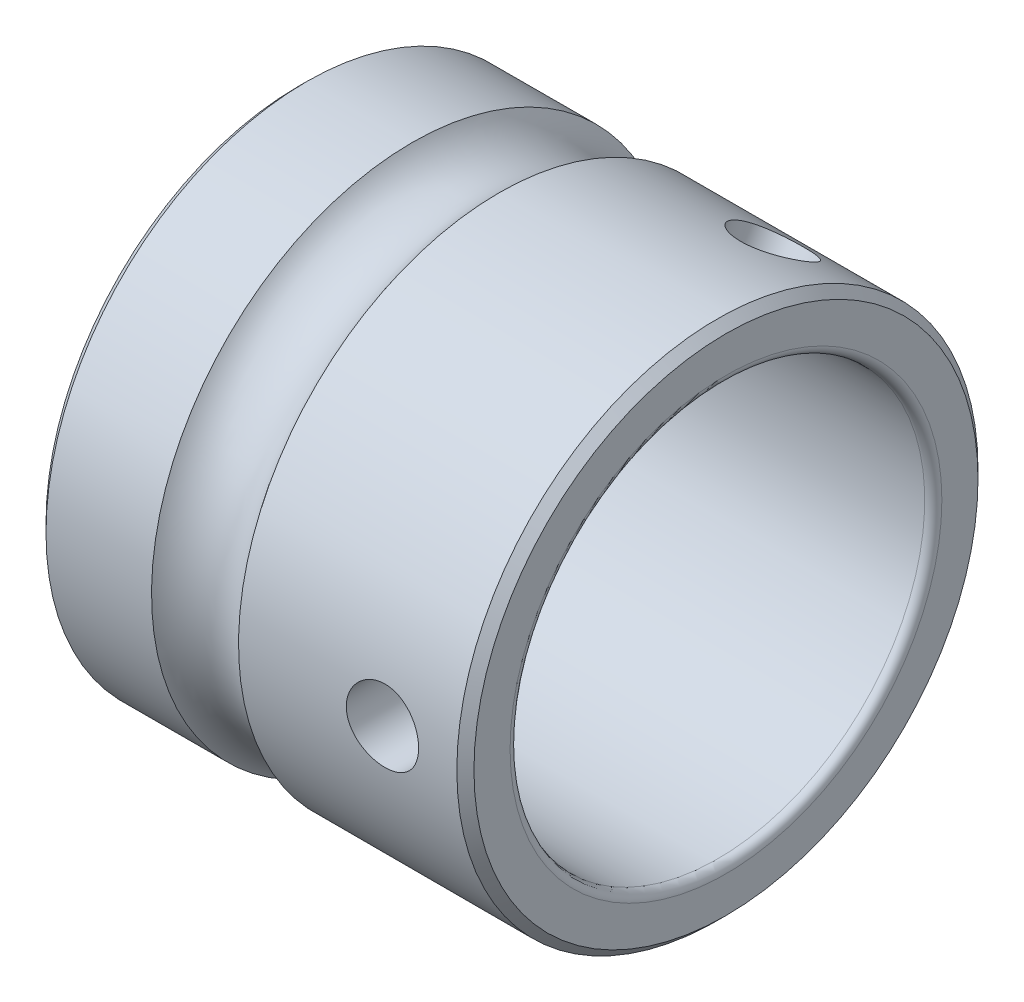
ISO-10303-21;
HEADER;
FILE_DESCRIPTION(('STEP AP214'),'2;1');
FILE_NAME('part.step','',(''),(''),'','','');
FILE_SCHEMA(('AUTOMOTIVE_DESIGN { 1 0 10303 214 1 1 1 1 }'));
ENDSEC;
DATA;
#1=APPLICATION_CONTEXT('core data for automotive mechanical design processes');
#2=APPLICATION_PROTOCOL_DEFINITION('international standard','automotive_design',2000,#1);
#3=PRODUCT_CONTEXT('',#1,'mechanical');
#4=PRODUCT('Part','Part','',(#3));
#5=PRODUCT_RELATED_PRODUCT_CATEGORY('part','',(#4));
#6=PRODUCT_DEFINITION_FORMATION('','',#4);
#7=PRODUCT_DEFINITION_CONTEXT('part definition',#1,'design');
#8=PRODUCT_DEFINITION('design','',#6,#7);
#9=PRODUCT_DEFINITION_SHAPE('','',#8);
#10=(LENGTH_UNIT() NAMED_UNIT(*) SI_UNIT(.MILLI.,.METRE.));
#11=(NAMED_UNIT(*) PLANE_ANGLE_UNIT() SI_UNIT($,.RADIAN.));
#12=(NAMED_UNIT(*) SI_UNIT($,.STERADIAN.) SOLID_ANGLE_UNIT());
#13=UNCERTAINTY_MEASURE_WITH_UNIT(LENGTH_MEASURE(1.E-05),#10,'distance_accuracy_value','');
#14=(GEOMETRIC_REPRESENTATION_CONTEXT(3) GLOBAL_UNCERTAINTY_ASSIGNED_CONTEXT((#13)) GLOBAL_UNIT_ASSIGNED_CONTEXT((#10,
#11,#12)) REPRESENTATION_CONTEXT('',''));
#15=CARTESIAN_POINT('',(0.,0.,0.));
#16=DIRECTION('',(0.,0.,1.));
#17=DIRECTION('',(1.,0.,0.));
#18=AXIS2_PLACEMENT_3D('',#15,#16,#17);
#19=CARTESIAN_POINT('',(-11.6063129103904,0.,0.));
#20=DIRECTION('',(1.,0.,0.));
#21=DIRECTION('',(0.,0.,-1.));
#22=AXIS2_PLACEMENT_3D('',#19,#20,#21);
#23=CYLINDRICAL_SURFACE('',#22,31.42);
#24=CARTESIAN_POINT('',(-5.24462582078074,0.,0.));
#25=DIRECTION('',(1.,0.,0.));
#26=DIRECTION('',(0.,1.,0.));
#27=AXIS2_PLACEMENT_3D('',#24,#25,#26);
#28=CIRCLE('',#27,31.42);
#29=CARTESIAN_POINT('',(-5.24462582078074,31.42,0.));
#30=VERTEX_POINT('',#29);
#31=EDGE_CURVE('E292',#30,#30,#28,.T.);
#32=ORIENTED_EDGE('',*,*,#31,.F.);
#33=EDGE_LOOP('',(#32));
#34=FACE_BOUND('',#33,.T.);
#35=CARTESIAN_POINT('',(-17.968,0.,0.));
#36=DIRECTION('',(1.,0.,0.));
#37=DIRECTION('',(0.,0.,1.));
#38=AXIS2_PLACEMENT_3D('',#35,#36,#37);
#39=CIRCLE('',#38,31.42);
#40=CARTESIAN_POINT('',(-17.968,0.,31.42));
#41=VERTEX_POINT('',#40);
#42=EDGE_CURVE('E132',#41,#41,#39,.F.);
#43=ORIENTED_EDGE('',*,*,#42,.F.);
#44=EDGE_LOOP('',(#43));
#45=FACE_BOUND('',#44,.T.);
#46=ADVANCED_FACE('F14',(#34,#45),#23,.T.);
#47=CARTESIAN_POINT('',(-6.05382410867605E-11,0.,0.));
#48=DIRECTION('',(1.,0.,0.));
#49=DIRECTION('',(0.,1.,0.));
#50=AXIS2_PLACEMENT_3D('',#47,#48,#49);
#51=TOROIDAL_SURFACE('',#50,35.000000000292,6.35000000011462);
#52=ORIENTED_EDGE('',*,*,#31,.T.);
#53=EDGE_LOOP('',(#52));
#54=FACE_BOUND('',#53,.T.);
#55=CARTESIAN_POINT('',(5.24462582069814,0.,0.));
#56=DIRECTION('',(1.,0.,0.));
#57=DIRECTION('',(0.,0.,-1.));
#58=AXIS2_PLACEMENT_3D('',#55,#56,#57);
#59=CIRCLE('',#58,31.4200000000282);
#60=CARTESIAN_POINT('',(5.24462582069814,0.,-31.4200000000282));
#61=VERTEX_POINT('',#60);
#62=EDGE_CURVE('E129',#61,#61,#59,.T.);
#63=ORIENTED_EDGE('',*,*,#62,.F.);
#64=EDGE_LOOP('',(#63));
#65=FACE_BOUND('',#64,.T.);
#66=ADVANCED_FACE('F135',(#54,#65),#51,.F.);
#67=CARTESIAN_POINT('',(31.568,0.,0.));
#68=DIRECTION('',(-1.,0.,0.));
#69=DIRECTION('',(0.,0.,1.));
#70=AXIS2_PLACEMENT_3D('',#67,#68,#69);
#71=CONICAL_SURFACE('',#70,31.42,0.785398163397452);
#72=CARTESIAN_POINT('',(32.6,0.,0.));
#73=DIRECTION('',(-1.,0.,0.));
#74=DIRECTION('',(0.,0.,1.));
#75=AXIS2_PLACEMENT_3D('',#72,#73,#74);
#76=CIRCLE('',#75,30.388);
#77=CARTESIAN_POINT('',(32.6,0.,30.388));
#78=VERTEX_POINT('',#77);
#79=EDGE_CURVE('E17',#78,#78,#76,.F.);
#80=ORIENTED_EDGE('',*,*,#79,.F.);
#81=EDGE_LOOP('',(#80));
#82=FACE_BOUND('',#81,.T.);
#83=CARTESIAN_POINT('',(31.568,0.,0.));
#84=DIRECTION('',(1.,0.,0.));
#85=DIRECTION('',(0.,0.,-1.));
#86=AXIS2_PLACEMENT_3D('',#83,#84,#85);
#87=CIRCLE('',#86,31.4200000000282);
#88=CARTESIAN_POINT('',(31.568,0.,-31.4200000000282));
#89=VERTEX_POINT('',#88);
#90=EDGE_CURVE('E121',#89,#89,#87,.F.);
#91=ORIENTED_EDGE('',*,*,#90,.F.);
#92=EDGE_LOOP('',(#91));
#93=FACE_BOUND('',#92,.T.);
#94=ADVANCED_FACE('F138',(#82,#93),#71,.T.);
#95=CARTESIAN_POINT('',(-17.968,0.,0.));
#96=DIRECTION('',(1.,0.,0.));
#97=DIRECTION('',(0.,0.,-1.));
#98=AXIS2_PLACEMENT_3D('',#95,#96,#97);
#99=CONICAL_SURFACE('',#98,31.42,0.785398163397448);
#100=ORIENTED_EDGE('',*,*,#42,.T.);
#101=EDGE_LOOP('',(#100));
#102=FACE_BOUND('',#101,.T.);
#103=CARTESIAN_POINT('',(-19.,0.,0.));
#104=DIRECTION('',(1.,0.,0.));
#105=DIRECTION('',(0.,0.,-1.));
#106=AXIS2_PLACEMENT_3D('',#103,#104,#105);
#107=CIRCLE('',#106,30.388);
#108=CARTESIAN_POINT('',(-19.,0.,-30.388));
#109=VERTEX_POINT('',#108);
#110=EDGE_CURVE('E166',#109,#109,#107,.F.);
#111=ORIENTED_EDGE('',*,*,#110,.F.);
#112=EDGE_LOOP('',(#111));
#113=FACE_BOUND('',#112,.T.);
#114=ADVANCED_FACE('F142',(#102,#113),#99,.T.);
#115=CARTESIAN_POINT('',(18.4063129103491,0.,0.));
#116=DIRECTION('',(1.,0.,0.));
#117=DIRECTION('',(0.,0.,-1.));
#118=AXIS2_PLACEMENT_3D('',#115,#116,#117);
#119=CYLINDRICAL_SURFACE('',#118,31.4200000000282);
#120=ORIENTED_EDGE('',*,*,#62,.T.);
#121=EDGE_LOOP('',(#120));
#122=FACE_BOUND('',#121,.T.);
#123=ORIENTED_EDGE('',*,*,#90,.T.);
#124=EDGE_LOOP('',(#123));
#125=FACE_BOUND('',#124,.T.);
#126=CARTESIAN_POINT('',(22.6,-4.36,31.1160215966272));
#127=CARTESIAN_POINT('',(22.4781439605067,-4.36000028885953,31.1160213328249));
#128=CARTESIAN_POINT('',(22.3563042300934,-4.35488624588262,31.1167396799184));
#129=CARTESIAN_POINT('',(22.1134877119475,-4.33448635530474,31.1195873630422));
#130=CARTESIAN_POINT('',(21.9925111480875,-4.31919795932851,31.1217170525716));
#131=CARTESIAN_POINT('',(21.6320016343975,-4.25815460713502,31.1301520130564));
#132=CARTESIAN_POINT('',(21.3948999541513,-4.19722149668396,31.1385031683592));
#133=CARTESIAN_POINT('',(20.9346832104327,-4.03679982265179,31.1597030101897));
#134=CARTESIAN_POINT('',(20.7115580517538,-3.93733946911539,31.1725484053241));
#135=CARTESIAN_POINT('',(20.2851703980544,-3.70274615153512,31.2012817781311));
#136=CARTESIAN_POINT('',(20.0819039706414,-3.56762026961565,31.2171691515847));
#137=CARTESIAN_POINT('',(19.6996286362064,-3.2645546009021,31.2503182844977));
#138=CARTESIAN_POINT('',(19.5207739762105,-3.09642117878363,31.2675877796414));
#139=CARTESIAN_POINT('',(19.1936798081257,-2.73248011410228,31.3014901238441));
#140=CARTESIAN_POINT('',(19.0454486124054,-2.53666498190386,31.3181227990503));
#141=CARTESIAN_POINT('',(18.783239731258,-2.12189336613058,31.3489613417113));
#142=CARTESIAN_POINT('',(18.6694200820525,-1.90283617499985,31.3631558870098));
#143=CARTESIAN_POINT('',(18.480360958041,-1.44863736985925,31.3874076608577));
#144=CARTESIAN_POINT('',(18.4050784387897,-1.2135140354252,31.397469502978));
#145=CARTESIAN_POINT('',(18.3135768331526,-0.81426620218851,31.4098549226556));
#146=CARTESIAN_POINT('',(18.2860251653387,-0.652693099828707,31.4136410400557));
#147=CARTESIAN_POINT('',(18.2492333103389,-0.327436645000443,31.4187148420164));
#148=CARTESIAN_POINT('',(18.2399929388226,-0.16375331379127,31.4200025517273));
#149=CARTESIAN_POINT('',(18.2400105057765,0.243635815555746,31.4199962035536));
#150=CARTESIAN_POINT('',(18.2604912663354,0.487426545597846,31.4171362651991));
#151=CARTESIAN_POINT('',(18.3418636910551,0.968217614006117,31.4060019915982));
#152=CARTESIAN_POINT('',(18.4027983190611,1.20521045324248,31.3977219000338));
#153=CARTESIAN_POINT('',(18.5632348628189,1.66536274744144,31.3766790092347));
#154=CARTESIAN_POINT('',(18.6627082821704,1.88853228255821,31.3639195228124));
#155=CARTESIAN_POINT('',(18.8973330209615,2.31496996046621,31.3353322181702));
#156=CARTESIAN_POINT('',(19.0324783903694,2.51824141448552,31.3195049117752));
#157=CARTESIAN_POINT('',(19.3355821870425,2.90052281918931,31.2864260870907));
#158=CARTESIAN_POINT('',(19.5037331360614,3.07937944758468,31.269166573188));
#159=CARTESIAN_POINT('',(19.8676613593569,3.40643259659328,31.2352320096018));
#160=CARTESIAN_POINT('',(20.0634402115443,3.55462736482445,31.2185569933685));
#161=CARTESIAN_POINT('',(20.4780803916985,3.8167341588132,31.1876015981238));
#162=CARTESIAN_POINT('',(20.6970348931987,3.93050011198795,31.1733315329895));
#163=CARTESIAN_POINT('',(21.151173674659,4.1195864835792,31.1489093275967));
#164=CARTESIAN_POINT('',(21.3863571707184,4.194908757447,31.1387569886045));
#165=CARTESIAN_POINT('',(21.8646761230343,4.30449894420552,31.1237973152869));
#166=CARTESIAN_POINT('',(22.1077507675658,4.33902756533294,31.1189560527665));
#167=CARTESIAN_POINT('',(22.5962895619403,4.36685688174697,31.1150633911675));
#168=CARTESIAN_POINT('',(22.8417535971883,4.36015954459612,31.1160117157733));
#169=CARTESIAN_POINT('',(23.3262697550033,4.30594301869854,31.1235598341446));
#170=CARTESIAN_POINT('',(23.5653549471946,4.25871287117661,31.1301196113345));
#171=CARTESIAN_POINT('',(24.0321812580593,4.12521342525057,31.1480899000041));
#172=CARTESIAN_POINT('',(24.2599220048494,4.0389428479925,31.1595005703845));
#173=CARTESIAN_POINT('',(24.6984594756343,3.82953664979193,31.1859293365885));
#174=CARTESIAN_POINT('',(24.9091955893904,3.70627596350621,31.2009596359492));
#175=CARTESIAN_POINT('',(25.3071661824918,3.42636131715183,31.2329340878944));
#176=CARTESIAN_POINT('',(25.4944012107407,3.26970813724617,31.2498781957614));
#177=CARTESIAN_POINT('',(25.7543209987039,3.01246785366675,31.2753732662712));
#178=CARTESIAN_POINT('',(25.8378107787805,2.92254008572263,31.2839247271346));
#179=CARTESIAN_POINT('',(25.9969218599237,2.73596880189606,31.3007928737723));
#180=CARTESIAN_POINT('',(26.0725460192785,2.6393277469981,31.3091096440247));
#181=CARTESIAN_POINT('',(26.2154514865844,2.43991347389765,31.3252811380016));
#182=CARTESIAN_POINT('',(26.2827258155648,2.33713523094913,31.3331354723685));
#183=CARTESIAN_POINT('',(26.4083629050489,2.12627039525691,31.3481504926417));
#184=CARTESIAN_POINT('',(26.4667290053922,2.01818581213278,31.3553114381407));
#185=CARTESIAN_POINT('',(26.5742437785161,1.79724939849194,31.3687513622715));
#186=CARTESIAN_POINT('',(26.6233769476182,1.68438993255117,31.3750288530715));
#187=CARTESIAN_POINT('',(26.7119260615412,1.45491651189205,31.3865067803008));
#188=CARTESIAN_POINT('',(26.7513457283886,1.33830401468894,31.3917076291561));
#189=CARTESIAN_POINT('',(26.8201384739176,1.10232137409462,31.4008790974697));
#190=CARTESIAN_POINT('',(26.8495283925863,0.982956215866032,31.4048517779616));
#191=CARTESIAN_POINT('',(26.8981201363818,0.742182802466858,31.4114637410577));
#192=CARTESIAN_POINT('',(26.9173268939031,0.620775565868482,31.4141036691745));
#193=CARTESIAN_POINT('',(26.9409070378546,0.4160179001002,31.4173549268338));
#194=CARTESIAN_POINT('',(26.9480642480532,0.332983528542977,31.4183456017258));
#195=CARTESIAN_POINT('',(26.9576109495109,0.166635680973159,31.4196682167637));
#196=CARTESIAN_POINT('',(26.9600004352284,0.0833222046362633,31.420000156144));
#197=CARTESIAN_POINT('',(26.959999363981,-0.121762525423821,31.4199997718891));
#198=CARTESIAN_POINT('',(26.954894978765,-0.243543690397607,31.419290343672));
#199=CARTESIAN_POINT('',(26.9345096773243,-0.486282816040932,31.4164713950618));
#200=CARTESIAN_POINT('',(26.9192239433273,-0.60724035958924,31.4143612118387));
#201=CARTESIAN_POINT('',(26.8785536482422,-0.847620637553832,31.4087951840496));
#202=CARTESIAN_POINT('',(26.8531525741228,-0.96704053108043,31.4053371393313));
#203=CARTESIAN_POINT('',(26.7924304527545,-1.20333439937484,31.3971713509501));
#204=CARTESIAN_POINT('',(26.7571056519217,-1.32020739273484,31.3924631344552));
#205=CARTESIAN_POINT('',(26.6768616932676,-1.55036429097719,31.3819378442981));
#206=CARTESIAN_POINT('',(26.6319568913194,-1.66365327806917,31.3761224311854));
#207=CARTESIAN_POINT('',(26.5328304688494,-1.8860737972753,31.363538372017));
#208=CARTESIAN_POINT('',(26.4786054101329,-1.99520377693784,31.3567693743555));
#209=CARTESIAN_POINT('',(26.3612868919929,-2.20841913925438,31.3424742765105));
#210=CARTESIAN_POINT('',(26.2982006767746,-2.31250855013999,31.3349487961843));
#211=CARTESIAN_POINT('',(26.1635471313451,-2.5150600690941,31.3193422080005));
#212=CARTESIAN_POINT('',(26.0919766647469,-2.61352007606912,31.3112608951337));
#213=CARTESIAN_POINT('',(25.9404448248629,-2.80463616564106,31.2947227107593));
#214=CARTESIAN_POINT('',(25.8604383166102,-2.89725630289333,31.2862639749068));
#215=CARTESIAN_POINT('',(25.6928986901886,-3.0754741347036,31.2692481014114));
#216=CARTESIAN_POINT('',(25.60536277492,-3.16106919623936,31.2606909282316));
#217=CARTESIAN_POINT('',(25.4234009934648,-3.32460061746563,31.2437224126652));
#218=CARTESIAN_POINT('',(25.3289754155396,-3.40253729726069,31.2353110641955));
#219=CARTESIAN_POINT('',(25.1338499828762,-3.5502368848724,31.2188683890865));
#220=CARTESIAN_POINT('',(25.0331479061599,-3.61999687254772,31.2108371988197));
#221=CARTESIAN_POINT('',(24.8257387964435,-3.75110718196944,31.1953517981783));
#222=CARTESIAN_POINT('',(24.7190071306648,-3.81241886734283,31.1879003023347));
#223=CARTESIAN_POINT('',(24.5007001414539,-3.92582081920585,31.1738287192687));
#224=CARTESIAN_POINT('',(24.3891248156751,-3.97791108122807,31.1672086324491));
#225=CARTESIAN_POINT('',(24.1620325363125,-4.07243949636983,31.154998128714));
#226=CARTESIAN_POINT('',(24.0465196858897,-4.1148873639944,31.1494066765611));
#227=CARTESIAN_POINT('',(23.8123091842008,-4.18987205683866,31.1394091010117));
#228=CARTESIAN_POINT('',(23.6936122404762,-4.22241106439077,31.1350027166402));
#229=CARTESIAN_POINT('',(23.4142506582936,-4.28641366526171,31.1262661278478));
#230=CARTESIAN_POINT('',(23.2526612804907,-4.31397980234257,31.1224407952078));
#231=CARTESIAN_POINT('',(22.9273714486608,-4.35077269554986,31.1173187178144));
#232=CARTESIAN_POINT('',(22.7636710131036,-4.35999961201814,31.1160219509534));
#233=CARTESIAN_POINT('',(22.6,-4.36,31.1160215966272));
#234=B_SPLINE_CURVE_WITH_KNOTS('',3,(#126,#127,#128,#129,#130,#131,#132,#133,#134,#135,#136,
#137,#138,#139,#140,#141,#142,#143,#144,#145,#146,#147,#148,#149,#150,#151,#152,#153,#154,#155,
#156,#157,#158,#159,#160,#161,#162,#163,#164,#165,#166,#167,#168,#169,#170,#171,#172,#173,#174,
#175,#176,#177,#178,#179,#180,#181,#182,#183,#184,#185,#186,#187,#188,#189,#190,#191,#192,#193,
#194,#195,#196,#197,#198,#199,#200,#201,#202,#203,#204,#205,#206,#207,#208,#209,#210,#211,#212,
#213,#214,#215,#216,#217,#218,#219,#220,#221,#222,#223,#224,#225,#226,#227,#228,#229,#230,#231,
#232,#233),.UNSPECIFIED.,.T.,.F.,(4,2,2,2,2,2,2,2,2,2,2,2,2,2,2,2,2,2,2,2,2,2,2,2,2,2,2,2,2,2,2,
2,2,2,2,2,2,2,2,2,2,2,2,2,2,2,2,2,2,2,2,2,2,4),(0.,0.365416070032876,0.730923700476167,
1.46197181264685,2.19248565258952,2.92285454296918,3.65764350377461,4.39263165285107,
5.13094570509602,5.86843328049128,6.3592953848962,6.85015254801897,7.5804607322627,
8.31154578042212,9.04209127733523,9.772514997192,10.5073331713012,11.2421933300358,
11.9801289569181,12.7180289645996,13.4511871673455,14.1843103794328,14.9122486908975,
15.6402108492866,16.3706625569622,17.1010972006552,17.4697595206913,17.8382874009815,
18.2071212597879,18.5758164952974,18.9451254069291,19.3142925856884,19.6828368461029,
20.0512024321131,20.3011164250166,20.5510307084039,20.9162418117053,21.2816258542864,
21.6476088382615,22.013730439695,22.3793072047886,22.7450191198529,23.1104337783204,
23.4759839439503,23.8436000008736,24.2113532182401,24.5790910577365,24.9469598298293,
25.316458770758,25.685957890693,26.0550830806624,26.4241269154158,26.9149400220156,
27.4057488373628),.UNSPECIFIED.);
#235=CARTESIAN_POINT('',(22.6,-4.36,31.1160215966272));
#236=VERTEX_POINT('',#235);
#237=EDGE_CURVE('E80',#236,#236,#234,.T.);
#238=ORIENTED_EDGE('',*,*,#237,.T.);
#239=EDGE_LOOP('',(#238));
#240=FACE_BOUND('',#239,.T.);
#241=CARTESIAN_POINT('',(22.6,29.1272651673844,-11.7821400378135));
#242=CARTESIAN_POINT('',(22.4781439605067,29.1272650833547,-11.7821396557527));
#243=CARTESIAN_POINT('',(22.3563042300934,29.1253301686979,-11.7869277204334));
#244=CARTESIAN_POINT('',(22.1134877119475,29.1175963893361,-11.8060183854702));
#245=CARTESIAN_POINT('',(21.9925111480875,29.1117965565826,-11.8203233695335));
#246=CARTESIAN_POINT('',(21.6320016343975,29.0885797705456,-11.8774059435075));
#247=CARTESIAN_POINT('',(21.3948999541513,29.0653455279633,-11.9343511427412));
#248=CARTESIAN_POINT('',(20.9346832104326,29.0034942925286,-12.0838803086859));
#249=CARTESIAN_POINT('',(20.7115580517538,28.9648885542684,-12.176438199085));
#250=CARTESIAN_POINT('',(20.2851703980544,28.8724757262656,-12.3939686580711));
#251=CARTESIAN_POINT('',(20.0819039706414,28.818671654316,-12.5189347912489));
#252=CARTESIAN_POINT('',(19.6996286362064,28.6958468111753,-12.7979719258263));
#253=CARTESIAN_POINT('',(19.5207739762105,28.6267359216212,-12.952214488178));
#254=CARTESIAN_POINT('',(19.1936798081257,28.4741256806078,-13.2843478677737));
#255=CARTESIAN_POINT('',(19.0454486124054,28.3906224337701,-13.4622450843061));
#256=CARTESIAN_POINT('',(18.783239731258,28.2099435872436,-13.836867111665));
#257=CARTESIAN_POINT('',(18.6694200820525,28.1127078285018,-14.033673476715));
#258=CARTESIAN_POINT('',(18.480360958041,27.9066110781706,-14.4391470672593));
#259=CARTESIAN_POINT('',(18.4050784387897,27.7977632218387,-14.6478007689618));
#260=CARTESIAN_POINT('',(18.3135768331526,27.6088653932977,-14.9997522447895));
#261=CARTESIAN_POINT('',(18.2860251653387,27.531357715968,-15.1415717147014));
#262=CARTESIAN_POINT('',(18.2492333103389,27.3731235299456,-15.4257889683079));
#263=CARTESIAN_POINT('',(18.2399929388226,27.2923970536634,-15.5681867461666));
#264=CARTESIAN_POINT('',(18.2400105057765,27.0886969913101,-15.9209929073198));
#265=CARTESIAN_POINT('',(18.2604912663354,26.9643248470208,-16.1306919035662));
#266=CARTESIAN_POINT('',(18.3418636910551,26.7142867490256,-16.54150204592));
#267=CARTESIAN_POINT('',(18.4027983190611,26.588619559767,-16.7426038194315));
#268=CARTESIAN_POINT('',(18.5632348628189,26.3403197346665,-17.1305859504179));
#269=CARTESIAN_POINT('',(18.6627082821704,26.2176849277272,-17.3174766939687));
#270=CARTESIAN_POINT('',(18.8973330209615,25.9797087567272,-17.6724889038467));
#271=CARTESIAN_POINT('',(19.0324783903694,25.864366180306,-17.8406134936941));
#272=CARTESIAN_POINT('',(19.3355821870425,25.64457837545,-18.1551394892198));
#273=CARTESIAN_POINT('',(19.5037331360613,25.5402028837557,-18.3014041160941));
#274=CARTESIAN_POINT('',(19.8676613593569,25.3472881151193,-18.5676731697301));
#275=CARTESIAN_POINT('',(20.0634402115443,25.2587497433372,-18.6876760956096));
#276=CARTESIAN_POINT('',(20.4780803916985,25.1008881876768,-18.899189540086));
#277=CARTESIAN_POINT('',(20.6970348931987,25.0316469721694,-18.9905787130539));
#278=CARTESIAN_POINT('',(21.151173674659,24.9159535360871,-19.1421212116649));
#279=CARTESIAN_POINT('',(21.3863571707184,24.8695002156782,-19.2022760448092));
#280=CARTESIAN_POINT('',(21.8646761230343,24.8017496651736,-19.2897040938887));
#281=CARTESIAN_POINT('',(22.1077507675658,24.7802926982808,-19.3171861256826));
#282=CARTESIAN_POINT('',(22.5962895619403,24.7630068962407,-19.3393406898676));
#283=CARTESIAN_POINT('',(22.8417535971883,24.7671768380158,-19.3340147880601));
#284=CARTESIAN_POINT('',(23.3262697550033,24.8008219632249,-19.2908359585135));
#285=CARTESIAN_POINT('',(23.5653549471946,24.8301179706755,-19.25321333953));
#286=CARTESIAN_POINT('',(24.0321812580593,24.9124304201397,-19.1465845723017));
#287=CARTESIAN_POINT('',(24.2599220048494,24.9654476391924,-19.0775773959873));
#288=CARTESIAN_POINT('',(24.6984594756343,25.0930387212161,-18.9094406917377));
#289=CARTESIAN_POINT('',(24.9091955893904,25.1676856854318,-18.8102089558067));
#290=CARTESIAN_POINT('',(25.3071661824918,25.3353336962655,-18.583782987145));
#291=CARTESIAN_POINT('',(25.4944012107407,25.4283343140757,-18.4565894076966));
#292=CARTESIAN_POINT('',(25.7543209987039,25.5790338345982,-18.246560322495));
#293=CARTESIAN_POINT('',(25.8378107787805,25.6314035009174,-18.1729563213815));
#294=CARTESIAN_POINT('',(25.9969218599237,25.7392973863337,-18.0198149232899));
#295=CARTESIAN_POINT('',(26.0725460192785,25.7948204480986,-17.9402796998259));
#296=CARTESIAN_POINT('',(26.2154514865844,25.90853250925,-17.7756676204321));
#297=CARTESIAN_POINT('',(26.2827258155648,25.9667236838159,-17.6905862182659));
#298=CARTESIAN_POINT('',(26.4083629050489,26.0851594906569,-17.5154794239281));
#299=CARTESIAN_POINT('',(26.4667290053922,26.1454033429362,-17.4254559019347));
#300=CARTESIAN_POINT('',(26.5742437785161,26.2675108654788,-17.2408393171661));
#301=CARTESIAN_POINT('',(26.6233769476182,26.329377064954,-17.1462388980038));
#302=CARTESIAN_POINT('',(26.7119260615412,26.454053951847,-16.9532480498344));
#303=CARTESIAN_POINT('',(26.7513457283886,26.5168642676784,-16.8548590892854));
#304=CARTESIAN_POINT('',(26.8201384739176,26.6427983125252,-16.6550778618354));
#305=CARTESIAN_POINT('',(26.8495283925863,26.7059213338666,-16.5536909427286));
#306=CARTESIAN_POINT('',(26.8981201363818,26.8320341685763,-16.3484810317171));
#307=CARTESIAN_POINT('',(26.9173268939031,26.8950240316888,-16.2446592446781));
#308=CARTESIAN_POINT('',(26.9409070378546,27.0002185363001,-16.0689595333328));
#309=CARTESIAN_POINT('',(26.9480642480532,27.0425936717021,-15.9975449956229));
#310=CARTESIAN_POINT('',(26.9576109495109,27.1269130137093,-15.8541448412815));
#311=CARTESIAN_POINT('',(26.9600004352284,27.1688572198135,-15.7821592239863));
#312=CARTESIAN_POINT('',(26.959999363981,27.2713992520691,-15.6045504456986));
#313=CARTESIAN_POINT('',(26.954894978765,27.3316754516979,-15.4987301490203));
#314=CARTESIAN_POINT('',(26.9345096773243,27.4506037334111,-15.2871024254156));
#315=CARTESIAN_POINT('',(26.9192239433273,27.5092550329075,-15.1812950283119));
#316=CARTESIAN_POINT('',(26.8785536482422,27.6246248504262,-14.9703365871313));
#317=CARTESIAN_POINT('',(26.8531525741228,27.681340042616,-14.8651869032608));
#318=CARTESIAN_POINT('',(26.7924304527545,27.7924151965832,-14.6564675163688));
#319=CARTESIAN_POINT('',(26.7571056519217,27.846774258172,-14.5528984268552));
#320=CARTESIAN_POINT('',(26.6768616932676,27.9527375386349,-14.3483140610426));
#321=CARTESIAN_POINT('',(26.6319568913193,28.0043457366919,-14.2472952136956));
#322=CARTESIAN_POINT('',(26.5328304688494,28.1046578813724,-14.0483813641559));
#323=CARTESIAN_POINT('',(26.4786054101329,28.1533607472706,-13.9504875306229));
#324=CARTESIAN_POINT('',(26.3612868919929,28.2475885105456,-13.7586900614572));
#325=CARTESIAN_POINT('',(26.2982006767746,28.2931159588502,-13.6647832472023));
#326=CARTESIAN_POINT('',(26.1635471313451,28.3808760164937,-13.4815651921209));
#327=CARTESIAN_POINT('',(26.0919766647469,28.4231073977426,-13.3922556683904));
#328=CARTESIAN_POINT('',(25.9404448248629,28.5043429547279,-13.2184751875619));
#329=CARTESIAN_POINT('',(25.8604383166102,28.5433275432218,-13.1340344278732));
#330=CARTESIAN_POINT('',(25.6928986901886,28.6177002804124,-12.9711853213705));
#331=CARTESIAN_POINT('',(25.60536277492,28.653087081822,-12.8927792370521));
#332=CARTESIAN_POINT('',(25.4234009934648,28.7201576268901,-12.74267261417));
#333=CARTESIAN_POINT('',(25.3289754155396,28.7518415253328,-12.670971795346));
#334=CARTESIAN_POINT('',(25.1338499828762,28.811451544788,-12.5348388627912));
#335=CARTESIAN_POINT('',(25.0331479061599,28.8393763238321,-12.4704093461634));
#336=CARTESIAN_POINT('',(24.8257387964435,28.8915207281997,-12.3491217871854));
#337=CARTESIAN_POINT('',(24.7190071306648,28.9157233861896,-12.2922985621814));
#338=CARTESIAN_POINT('',(24.5007001414539,28.9602380137145,-12.1870537994963));
#339=CARTESIAN_POINT('',(24.3891248156751,28.9805499813646,-12.1386322658855));
#340=CARTESIAN_POINT('',(24.1620325363125,29.0172395825079,-12.0506630051257));
#341=CARTESIAN_POINT('',(24.0465196858897,29.0336211767117,-12.0111063473499));
#342=CARTESIAN_POINT('',(23.8123091842008,29.0624553687318,-11.941168910677));
#343=CARTESIAN_POINT('',(23.6936122404762,29.0749088317033,-11.9107861113372));
#344=CARTESIAN_POINT('',(23.4142506582936,29.0993440243021,-11.8509899386785));
#345=CARTESIAN_POINT('',(23.2526612804907,29.1098142575984,-11.8252042973623));
#346=CARTESIAN_POINT('',(22.9273714486608,29.1237748550592,-11.7907796784694));
#347=CARTESIAN_POINT('',(22.7636710131036,29.1272652802489,-11.7821405509787));
#348=CARTESIAN_POINT('',(22.6,29.1272651673844,-11.7821400378135));
#349=B_SPLINE_CURVE_WITH_KNOTS('',3,(#241,#242,#243,#244,#245,#246,#247,#248,#249,#250,#251,
#252,#253,#254,#255,#256,#257,#258,#259,#260,#261,#262,#263,#264,#265,#266,#267,#268,#269,#270,
#271,#272,#273,#274,#275,#276,#277,#278,#279,#280,#281,#282,#283,#284,#285,#286,#287,#288,#289,
#290,#291,#292,#293,#294,#295,#296,#297,#298,#299,#300,#301,#302,#303,#304,#305,#306,#307,#308,
#309,#310,#311,#312,#313,#314,#315,#316,#317,#318,#319,#320,#321,#322,#323,#324,#325,#326,#327,
#328,#329,#330,#331,#332,#333,#334,#335,#336,#337,#338,#339,#340,#341,#342,#343,#344,#345,#346,
#347,#348),.UNSPECIFIED.,.T.,.F.,(4,2,2,2,2,2,2,2,2,2,2,2,2,2,2,2,2,2,2,2,2,2,2,2,2,2,2,2,2,2,2,
2,2,2,2,2,2,2,2,2,2,2,2,2,2,2,2,2,2,2,2,2,2,4),(0.,0.365416070032876,0.730923700476166,
1.46197181264685,2.19248565258952,2.92285454296919,3.65764350377461,4.39263165285108,
5.13094570509603,5.86843328049128,6.3592953848962,6.85015254801897,7.58046073226269,
8.31154578042212,9.04209127733523,9.772514997192,10.5073331713012,11.2421933300357,
11.9801289569181,12.7180289645996,13.4511871673455,14.1843103794328,14.9122486908975,
15.6402108492866,16.3706625569622,17.1010972006552,17.4697595206913,17.8382874009815,
18.2071212597878,18.5758164952974,18.9451254069291,19.3142925856884,19.6828368461029,
20.0512024321131,20.3011164250166,20.5510307084039,20.9162418117053,21.2816258542864,
21.6476088382615,22.013730439695,22.3793072047886,22.7450191198528,23.1104337783204,
23.4759839439503,23.8436000008736,24.2113532182401,24.5790910577365,24.9469598298293,
25.316458770758,25.685957890693,26.0550830806624,26.4241269154158,26.9149400220156,
27.4057488373628),.UNSPECIFIED.);
#350=CARTESIAN_POINT('',(22.6,29.1272651673844,-11.7821400378135));
#351=VERTEX_POINT('',#350);
#352=EDGE_CURVE('E64',#351,#351,#349,.T.);
#353=ORIENTED_EDGE('',*,*,#352,.T.);
#354=EDGE_LOOP('',(#353));
#355=FACE_BOUND('',#354,.T.);
#356=ADVANCED_FACE('F145',(#122,#125,#240,#355),#119,.T.);
#357=CARTESIAN_POINT('',(32.6,0.,28.21));
#358=DIRECTION('',(1.,0.,0.));
#359=DIRECTION('',(0.,0.,-1.));
#360=AXIS2_PLACEMENT_3D('',#357,#358,#359);
#361=PLANE('',#360);
#362=ORIENTED_EDGE('',*,*,#79,.T.);
#363=EDGE_LOOP('',(#362));
#364=FACE_BOUND('',#363,.T.);
#365=CARTESIAN_POINT('',(32.6,0.,0.));
#366=DIRECTION('',(1.,0.,0.));
#367=DIRECTION('',(0.,0.,1.));
#368=AXIS2_PLACEMENT_3D('',#365,#366,#367);
#369=CIRCLE('',#368,26.032);
#370=CARTESIAN_POINT('',(32.6,0.,26.032));
#371=VERTEX_POINT('',#370);
#372=EDGE_CURVE('E76',#371,#371,#369,.T.);
#373=ORIENTED_EDGE('',*,*,#372,.F.);
#374=EDGE_LOOP('',(#373));
#375=FACE_BOUND('',#374,.T.);
#376=ADVANCED_FACE('F59',(#364,#375),#361,.T.);
#377=CARTESIAN_POINT('',(22.6,27.210518186907,-15.71));
#378=DIRECTION('',(0.,0.866025403784438,-0.500000000000001));
#379=DIRECTION('',(0.,0.500000000000001,0.866025403784438));
#380=AXIS2_PLACEMENT_3D('',#377,#378,#379);
#381=CYLINDRICAL_SURFACE('',#380,4.36);
#382=CARTESIAN_POINT('',(26.96,21.6506350946109,-12.5));
#383=CARTESIAN_POINT('',(26.9599894788075,21.5291823032381,-12.7103530820661));
#384=CARTESIAN_POINT('',(26.939631146759,21.4045643555251,-12.9190526500255));
#385=CARTESIAN_POINT('',(26.8587678553539,21.1528720997648,-13.3271776066663));
#386=CARTESIAN_POINT('',(26.7982211592784,21.0257953715473,-13.5265931229597));
#387=CARTESIAN_POINT('',(26.6388745624733,20.7737095989825,-13.9106331260076));
#388=CARTESIAN_POINT('',(26.5401093321441,20.6486987873806,-14.0952708359423));
#389=CARTESIAN_POINT('',(26.3072202340253,20.4052187850996,-14.4455044151808));
#390=CARTESIAN_POINT('',(26.1731011121039,20.2867487189775,-14.6111028360164));
#391=CARTESIAN_POINT('',(25.8718213834795,20.0598485933047,-14.9211183734438));
#392=CARTESIAN_POINT('',(25.7043636025298,19.9515227492691,-15.0653229985099));
#393=CARTESIAN_POINT('',(25.3417986988773,19.7506963898779,-15.3276662503296));
#394=CARTESIAN_POINT('',(25.1466895799687,19.6581970181323,-15.4458029936143));
#395=CARTESIAN_POINT('',(24.7327249530812,19.4925829592845,-15.654300363957));
#396=CARTESIAN_POINT('',(24.5137174771658,19.419603890062,-15.7444673271125));
#397=CARTESIAN_POINT('',(24.0591955570451,19.2973797465968,-15.8940405099273));
#398=CARTESIAN_POINT('',(23.8236823704395,19.2481328664032,-15.9534490702378));
#399=CARTESIAN_POINT('',(23.3453424638974,19.1762340491357,-16.0398006367055));
#400=CARTESIAN_POINT('',(23.1026130638273,19.1533197401325,-16.0670640028625));
#401=CARTESIAN_POINT('',(22.6146412759826,19.1343842128454,-16.0896106726953));
#402=CARTESIAN_POINT('',(22.369399080506,19.13836095178,-16.0848964055554));
#403=CARTESIAN_POINT('',(21.8862992859779,19.1727944706012,-16.0438348312719));
#404=CARTESIAN_POINT('',(21.6483894995997,19.2029507019369,-16.0078465545693));
#405=CARTESIAN_POINT('',(21.1837504221755,19.2878280009182,-15.9054728423195));
#406=CARTESIAN_POINT('',(20.9570216338598,19.3425501720042,-15.839086041344));
#407=CARTESIAN_POINT('',(20.5198343716824,19.4742575406658,-15.6768692657994));
#408=CARTESIAN_POINT('',(20.3094679283115,19.551358531834,-15.5808859863765));
#409=CARTESIAN_POINT('',(19.9118987984344,19.7242497412678,-15.3614247684516));
#410=CARTESIAN_POINT('',(19.7246963882256,19.8200401824236,-15.2379465020424));
#411=CARTESIAN_POINT('',(19.4640461766154,19.975200315248,-15.0332584964753));
#412=CARTESIAN_POINT('',(19.3799993718675,20.0292578754603,-14.9612021788705));
#413=CARTESIAN_POINT('',(19.219730770907,20.1405177494117,-14.8110857119955));
#414=CARTESIAN_POINT('',(19.1435061533267,20.1977189177774,-14.7330277453431));
#415=CARTESIAN_POINT('',(18.9993572324617,20.3147318168559,-14.5712609421965));
#416=CARTESIAN_POINT('',(18.931439825107,20.3745456612422,-14.4875474992942));
#417=CARTESIAN_POINT('',(18.8044798954116,20.496124735712,-14.3150270611146));
#418=CARTESIAN_POINT('',(18.7454340150967,20.5578892166898,-14.2262220107429));
#419=CARTESIAN_POINT('',(18.6365026652951,20.6829284856614,-14.043814340363));
#420=CARTESIAN_POINT('',(18.58663737462,20.7462062631702,-13.9502017171772));
#421=CARTESIAN_POINT('',(18.4966181867426,20.8735219902709,-13.758970412533));
#422=CARTESIAN_POINT('',(18.4564605297151,20.9375596354475,-13.6613532992277));
#423=CARTESIAN_POINT('',(18.3862000898339,21.0657270065628,-13.4628777751847));
#424=CARTESIAN_POINT('',(18.3560805783791,21.1298563986205,-13.362025067265));
#425=CARTESIAN_POINT('',(18.3060511908283,21.2577298001035,-13.1576381330068));
#426=CARTESIAN_POINT('',(18.286136418506,21.3214739798178,-13.0541052177271));
#427=CARTESIAN_POINT('',(18.2609435843359,21.4296437275668,-12.8754761553829));
#428=CARTESIAN_POINT('',(18.2530929449646,21.4742948539129,-12.8008690241082));
#429=CARTESIAN_POINT('',(18.2426209298637,21.5629730996087,-12.6509200504718));
#430=CARTESIAN_POINT('',(18.2399995628388,21.6070002179195,-12.5755782068873));
#431=CARTESIAN_POINT('',(18.2400006081065,21.711332726415,-12.3948680843881));
#432=CARTESIAN_POINT('',(18.2450743491199,21.7712713793917,-12.2892788110317));
#433=CARTESIAN_POINT('',(18.2653355716164,21.8892213496414,-12.0779404531112));
#434=CARTESIAN_POINT('',(18.2805277251857,21.94723176357,-11.9721913172479));
#435=CARTESIAN_POINT('',(18.3209443158685,22.0610256605263,-11.7611876783257));
#436=CARTESIAN_POINT('',(18.3461847215038,22.1168054426473,-11.6559342337078));
#437=CARTESIAN_POINT('',(18.4065129082105,22.2257396297065,-11.4468512371353));
#438=CARTESIAN_POINT('',(18.441604427661,22.278893028941,-11.3430222414619));
#439=CARTESIAN_POINT('',(18.5213060425462,22.3822024233999,-11.1377818601903));
#440=CARTESIAN_POINT('',(18.5659003029189,22.4323632295521,-11.0363667609157));
#441=CARTESIAN_POINT('',(18.6643047758767,22.5295727413462,-10.8365460257248));
#442=CARTESIAN_POINT('',(18.7181183915312,22.5766202888934,-10.7381415169491));
#443=CARTESIAN_POINT('',(18.8927590821208,22.7127446152272,-10.4487550175569));
#444=CARTESIAN_POINT('',(19.0269038878682,22.7969543924881,-10.263297170071));
#445=CARTESIAN_POINT('',(19.3281738683303,22.9519982728234,-9.9117700229546));
#446=CARTESIAN_POINT('',(19.4955957043625,23.0226999406513,-9.74589823604374));
#447=CARTESIAN_POINT('',(19.8581488202741,23.149477833498,-9.4408159075127));
#448=CARTESIAN_POINT('',(20.0532891808327,23.2055492484528,-9.3016141383192));
#449=CARTESIAN_POINT('',(20.4673803490626,23.3033401740513,-9.05385389120253));
#450=CARTESIAN_POINT('',(20.6864921346181,23.3449536905304,-8.94552273078333));
#451=CARTESIAN_POINT('',(21.1410803007624,23.4133627288225,-8.76492179845428));
#452=CARTESIAN_POINT('',(21.3765377455306,23.440175085074,-8.69261106706551));
#453=CARTESIAN_POINT('',(21.7777078798449,23.4727457482029,-8.60415967183527));
#454=CARTESIAN_POINT('',(21.9408328512077,23.4825305358019,-8.57736127254226));
#455=CARTESIAN_POINT('',(22.2692819461507,23.4955763219992,-8.54156030969887));
#456=CARTESIAN_POINT('',(22.4346060366196,23.4988374187105,-8.5325574785121));
#457=CARTESIAN_POINT('',(22.8428657411951,23.4988357464577,-8.53257696006602));
#458=CARTESIAN_POINT('',(23.0858821438062,23.4918016467626,-8.55201765764953));
#459=CARTESIAN_POINT('',(23.5651092398503,23.4636004258897,-8.62908289073571));
#460=CARTESIAN_POINT('',(23.8013125616329,23.4424185543816,-8.68674727741245));
#461=CARTESIAN_POINT('',(24.2598754546074,23.3858102893105,-8.83800617133512));
#462=CARTESIAN_POINT('',(24.4822474423184,23.3503968910365,-8.93156789598683));
#463=CARTESIAN_POINT('',(24.9072345459982,23.2651945100173,-9.15120397023958));
#464=CARTESIAN_POINT('',(25.1098528812181,23.2154078749336,-9.27727300987942));
#465=CARTESIAN_POINT('',(25.4917889844745,23.1008599570362,-9.558951002526));
#466=CARTESIAN_POINT('',(25.670865006709,23.0359598220362,-9.71483130867358));
#467=CARTESIAN_POINT('',(25.998569784614,22.8916312017603,-10.0501979783182));
#468=CARTESIAN_POINT('',(26.1471900667808,22.8121986848372,-10.2296908886516));
#469=CARTESIAN_POINT('',(26.4106895021973,22.6388670719484,-10.6077903216392));
#470=CARTESIAN_POINT('',(26.5253258934859,22.5448708662459,-10.8065215160698));
#471=CARTESIAN_POINT('',(26.7159586324548,22.3441936498282,-11.2155557559284));
#472=CARTESIAN_POINT('',(26.7919984427232,22.2375270747263,-11.4258454884057));
#473=CARTESIAN_POINT('',(26.8849154045359,22.050612890775,-11.781196314483));
#474=CARTESIAN_POINT('',(26.9130297560734,21.9732350731773,-11.9249290264454));
#475=CARTESIAN_POINT('',(26.9505754888728,21.8146059067766,-12.2126968368258));
#476=CARTESIAN_POINT('',(26.9600071658134,21.7333546192974,-12.356731930422));
#477=CARTESIAN_POINT('',(26.96,21.6506350946109,-12.5));
#478=B_SPLINE_CURVE_WITH_KNOTS('',3,(#382,#383,#384,#385,#386,#387,#388,#389,#390,#391,#392,
#393,#394,#395,#396,#397,#398,#399,#400,#401,#402,#403,#404,#405,#406,#407,#408,#409,#410,#411,
#412,#413,#414,#415,#416,#417,#418,#419,#420,#421,#422,#423,#424,#425,#426,#427,#428,#429,#430,
#431,#432,#433,#434,#435,#436,#437,#438,#439,#440,#441,#442,#443,#444,#445,#446,#447,#448,#449,
#450,#451,#452,#453,#454,#455,#456,#457,#458,#459,#460,#461,#462,#463,#464,#465,#466,#467,#468,
#469,#470,#471,#472,#473,#474,#475,#476,#477),.UNSPECIFIED.,.T.,.F.,(4,2,2,2,2,2,2,2,2,2,2,2,2,
2,2,2,2,2,2,2,2,2,2,2,2,2,2,2,2,2,2,2,2,2,2,2,2,2,2,2,2,2,2,2,2,2,2,4),(0.,0.728085111784269,
1.4569275454825,2.18511034522314,2.91319544422755,3.64808721831069,4.38303207276578,
5.12295763375244,5.86282687964828,6.59525850914115,7.32763450000875,8.05171214174905,
8.77582231049863,9.50374811366242,10.2316825985926,10.6009237102757,10.9700311695962,
11.3394429800641,11.7087146097723,12.0787884482554,12.4487187244311,12.8180293914685,
13.1871626972105,13.4489148289336,13.710667396371,14.0747743256619,14.4390494947233,
14.8039058898783,15.1689009312534,15.5332924474921,15.8978187597086,16.6258091942029,
17.360606868244,18.0956458219819,18.8359651135381,19.5754406419575,20.0712162141664,
20.5669843301032,21.294973964531,22.0237237811514,22.7518096582033,23.4797766801193,
24.2147157725136,24.9498590654688,25.6901338236677,26.4295731183545,26.9254679174106,
27.4213548681948),.UNSPECIFIED.);
#479=CARTESIAN_POINT('',(26.96,21.6506350946109,-12.5));
#480=VERTEX_POINT('',#479);
#481=EDGE_CURVE('E69',#480,#480,#478,.T.);
#482=ORIENTED_EDGE('',*,*,#481,.F.);
#483=EDGE_LOOP('',(#482));
#484=FACE_BOUND('',#483,.T.);
#485=ORIENTED_EDGE('',*,*,#352,.F.);
#486=EDGE_LOOP('',(#485));
#487=FACE_BOUND('',#486,.T.);
#488=ADVANCED_FACE('F53',(#484,#487),#381,.F.);
#489=CARTESIAN_POINT('',(-19.,0.,28.21));
#490=DIRECTION('',(-1.,0.,0.));
#491=DIRECTION('',(0.,0.,1.));
#492=AXIS2_PLACEMENT_3D('',#489,#490,#491);
#493=PLANE('',#492);
#494=CARTESIAN_POINT('',(-19.,0.,0.));
#495=DIRECTION('',(-1.,0.,0.));
#496=DIRECTION('',(0.,0.,1.));
#497=AXIS2_PLACEMENT_3D('',#494,#495,#496);
#498=CIRCLE('',#497,26.032);
#499=CARTESIAN_POINT('',(-19.,0.,26.032));
#500=VERTEX_POINT('',#499);
#501=EDGE_CURVE('E36',#500,#500,#498,.T.);
#502=ORIENTED_EDGE('',*,*,#501,.F.);
#503=EDGE_LOOP('',(#502));
#504=FACE_BOUND('',#503,.T.);
#505=ORIENTED_EDGE('',*,*,#110,.T.);
#506=EDGE_LOOP('',(#505));
#507=FACE_BOUND('',#506,.T.);
#508=ADVANCED_FACE('F42',(#504,#507),#493,.T.);
#509=CARTESIAN_POINT('',(22.6,0.,31.42));
#510=DIRECTION('',(0.,0.,1.));
#511=DIRECTION('',(1.,0.,0.));
#512=AXIS2_PLACEMENT_3D('',#509,#510,#511);
#513=CYLINDRICAL_SURFACE('',#512,4.36);
#514=CARTESIAN_POINT('',(18.24,0.,25.));
#515=CARTESIAN_POINT('',(18.2400006081065,-0.121395725570488,24.999999733286));
#516=CARTESIAN_POINT('',(18.2450743491199,-0.242808045152612,24.9991134927541));
#517=CARTESIAN_POINT('',(18.2653355716164,-0.484807417030701,24.9955919844057));
#518=CARTESIAN_POINT('',(18.2805277251857,-0.605394062080855,24.9929559086204));
#519=CARTESIAN_POINT('',(18.3209443158685,-0.845025522156597,24.986002494719));
#520=CARTESIAN_POINT('',(18.3461847215038,-0.964067570092026,24.9816824807444));
#521=CARTESIAN_POINT('',(18.4065129082105,-1.19960585015275,24.971480755792));
#522=CARTESIAN_POINT('',(18.441604427661,-1.31610109767265,24.9655984519899));
#523=CARTESIAN_POINT('',(18.5213060425462,-1.54549917896565,24.9524468214051));
#524=CARTESIAN_POINT('',(18.5659003029189,-1.65840763434089,24.9451798041699));
#525=CARTESIAN_POINT('',(18.6643047758767,-1.88006222311616,24.9294553432776));
#526=CARTESIAN_POINT('',(18.7181183915312,-1.98880680133645,24.9209974602514));
#527=CARTESIAN_POINT('',(18.8927590821208,-2.30748502448922,24.8941913352334));
#528=CARTESIAN_POINT('',(19.0269038878682,-2.51020112037365,24.8743902178454));
#529=CARTESIAN_POINT('',(19.3281738683303,-2.89215450006397,24.8328985833589));
#530=CARTESIAN_POINT('',(19.4955957043625,-3.07115451521384,24.8111921303324));
#531=CARTESIAN_POINT('',(19.8581488202742,-3.39875250839081,24.7684438419104));
#532=CARTESIAN_POINT('',(20.0532891808327,-3.54734048424151,24.7474022270906));
#533=CARTESIAN_POINT('',(20.4673803490626,-3.8108026150917,24.7082115293602));
#534=CARTESIAN_POINT('',(20.6864921346181,-3.92542691027574,24.6900843115623));
#535=CARTESIAN_POINT('',(21.1410803007624,-4.1160364247659,24.6590278104072));
#536=CARTESIAN_POINT('',(21.3765377455306,-4.19206553324054,24.6460926263619));
#537=CARTESIAN_POINT('',(21.7777078798449,-4.28495202007458,24.6300739504345));
#538=CARTESIAN_POINT('',(21.9408328512077,-4.31305250844258,24.6251486254194));
#539=CARTESIAN_POINT('',(22.2692819461507,-4.35057994484353,24.6185461262569));
#540=CARTESIAN_POINT('',(22.4346060366196,-4.36000717371293,24.6168689032597));
#541=CARTESIAN_POINT('',(22.8428657411951,-4.35998946606592,24.6168771958233));
#542=CARTESIAN_POINT('',(23.0858821438062,-4.33963627824373,24.6205058355862));
#543=CARTESIAN_POINT('',(23.5651092398503,-4.2587952182061,24.6346154784357));
#544=CARTESIAN_POINT('',(23.8013125616329,-4.19826545869637,24.6451036329484));
#545=CARTESIAN_POINT('',(24.2598754546074,-4.0389672814754,24.6717088842939));
#546=CARTESIAN_POINT('',(24.4822474423184,-3.94023375196816,24.6878208440802));
#547=CARTESIAN_POINT('',(24.9072345459982,-3.7074221415682,24.723851454781));
#548=CARTESIAN_POINT('',(25.1098528812181,-3.57334983306752,24.7437694838495));
#549=CARTESIAN_POINT('',(25.4917889844745,-3.2721355767999,24.7854070733231));
#550=CARTESIAN_POINT('',(25.670865006709,-3.10468920422641,24.8071420607778));
#551=CARTESIAN_POINT('',(25.998569784614,-2.74208883859365,24.849833143948));
#552=CARTESIAN_POINT('',(26.1471900667808,-2.54692715998414,24.8707890215728));
#553=CARTESIAN_POINT('',(26.4106895021973,-2.13281763941601,24.909729158026));
#554=CARTESIAN_POINT('',(26.5253258934859,-1.91371327366336,24.9276916532435));
#555=CARTESIAN_POINT('',(26.7159586324548,-1.45914062271934,24.9584172057944));
#556=CARTESIAN_POINT('',(26.7919984427232,-1.22369108468806,24.9711861082601));
#557=CARTESIAN_POINT('',(26.8849154045359,-0.822491150073705,24.9869890896693));
#558=CARTESIAN_POINT('',(26.9130297560734,-0.659326061360508,24.9918442899214));
#559=CARTESIAN_POINT('',(26.9505754888728,-0.330797243979326,24.9983513072275));
#560=CARTESIAN_POINT('',(26.9600071658134,-0.165433550148954,25.0000031749785));
#561=CARTESIAN_POINT('',(26.9599894788075,0.242897508520026,24.9999953383436));
#562=CARTESIAN_POINT('',(26.939631146759,0.485945609988219,24.9964228138364));
#563=CARTESIAN_POINT('',(26.8587678553539,0.9652383182377,24.9825134047325));
#564=CARTESIAN_POINT('',(26.7982211592784,1.20147558536531,24.9721694880131));
#565=CARTESIAN_POINT('',(26.6388745624733,1.66010687035666,24.9458768065633));
#566=CARTESIAN_POINT('',(26.5401093321441,1.88251322345757,24.9299331229357));
#567=CARTESIAN_POINT('',(26.3072202340253,2.30756440147702,24.8941900452661));
#568=CARTESIAN_POINT('',(26.1731011121039,2.51021187380829,24.8743911688341));
#569=CARTESIAN_POINT('',(25.8718213834795,2.89214326762467,24.8328976645933));
#570=CARTESIAN_POINT('',(25.7043636025298,3.07119105829294,24.8111870443052));
#571=CARTESIAN_POINT('',(25.3417986988773,3.39880015857582,24.7684379412327));
#572=CARTESIAN_POINT('',(25.1466895799687,3.54735926525352,24.7473995071093));
#573=CARTESIAN_POINT('',(24.7327249530812,3.81073031401648,24.7082222100945));
#574=CARTESIAN_POINT('',(24.5137174771658,3.92530672930247,24.690103963781));
#575=CARTESIAN_POINT('',(24.0591955570451,4.11595297707758,24.6590413419918));
#576=CARTESIAN_POINT('',(23.8236823704395,4.19202573960553,24.6460965728423));
#577=CARTESIAN_POINT('',(23.3453424638974,4.30275779845692,24.6270061538204));
#578=CARTESIAN_POINT('',(23.1026130638273,4.33782572064318,24.620793463192));
#579=CARTESIAN_POINT('',(22.6146412759826,4.36681947313263,24.6156681504436));
#580=CARTESIAN_POINT('',(22.369399080506,4.36074842856194,24.6167549738153));
#581=CARTESIAN_POINT('',(21.8862992859779,4.30797130270247,24.6260444887144));
#582=CARTESIAN_POINT('',(21.6483894995997,4.26172642517174,24.6341664127822));
#583=CARTESIAN_POINT('',(21.1837504221755,4.13062954019305,24.6564854537797));
#584=CARTESIAN_POINT('',(20.9570216338598,4.04577579852927,24.6706828436028));
#585=CARTESIAN_POINT('',(20.5198343716824,3.83943826565689,24.703636382957));
#586=CARTESIAN_POINT('',(20.3094679283115,3.71776381175395,24.7224161602541));
#587=CARTESIAN_POINT('',(19.9118987984344,3.44125921716866,24.7624137307524));
#588=CARTESIAN_POINT('',(19.7246963882256,3.28642868106508,24.7836315530284));
#589=CARTESIAN_POINT('',(19.4640461766154,3.03158360198182,24.8156601669253));
#590=CARTESIAN_POINT('',(19.3799993718675,2.94215222032674,24.8264472285334));
#591=CARTESIAN_POINT('',(19.219730770907,2.75651760951098,24.8477428723597));
#592=CARTESIAN_POINT('',(19.1435061533267,2.66031684323932,24.8582515539643));
#593=CARTESIAN_POINT('',(18.9993572324617,2.46171623268618,24.8787042955635));
#594=CARTESIAN_POINT('',(18.931439825107,2.35931134230138,24.8886478828488));
#595=CARTESIAN_POINT('',(18.8044798954116,2.1491147229309,24.9076782308184));
#596=CARTESIAN_POINT('',(18.7454340150967,2.04132505283579,24.916765315211));
#597=CARTESIAN_POINT('',(18.6365026652951,1.82083574195579,24.9338486634211));
#598=CARTESIAN_POINT('',(18.58663737462,1.70812594340759,24.9418425146458));
#599=CARTESIAN_POINT('',(18.4966181867426,1.47885691203655,24.9564855162942));
#600=CARTESIAN_POINT('',(18.4564605297151,1.36229918948177,24.963135187163));
#601=CARTESIAN_POINT('',(18.3862000898339,1.12633065807344,24.9748936244637));
#602=CARTESIAN_POINT('',(18.3560805783791,1.00692495494563,24.980004953155));
#603=CARTESIAN_POINT('',(18.3060511908283,0.765983976934962,24.9885531001785));
#604=CARTESIAN_POINT('',(18.286136418506,0.644449752317751,24.9919907215147));
#605=CARTESIAN_POINT('',(18.2609435843359,0.435667572598921,24.9963539398142));
#606=CARTESIAN_POINT('',(18.2530929449646,0.348730338438537,24.9977193839001));
#607=CARTESIAN_POINT('',(18.2426209298637,0.174531595150129,24.9995425106175));
#608=CARTESIAN_POINT('',(18.2399995628388,0.0872700854825542,25.0000001917379));
#609=CARTESIAN_POINT('',(18.24,0.,25.));
#610=B_SPLINE_CURVE_WITH_KNOTS('',3,(#514,#515,#516,#517,#518,#519,#520,#521,#522,#523,#524,
#525,#526,#527,#528,#529,#530,#531,#532,#533,#534,#535,#536,#537,#538,#539,#540,#541,#542,#543,
#544,#545,#546,#547,#548,#549,#550,#551,#552,#553,#554,#555,#556,#557,#558,#559,#560,#561,#562,
#563,#564,#565,#566,#567,#568,#569,#570,#571,#572,#573,#574,#575,#576,#577,#578,#579,#580,#581,
#582,#583,#584,#585,#586,#587,#588,#589,#590,#591,#592,#593,#594,#595,#596,#597,#598,#599,#600,
#601,#602,#603,#604,#605,#606,#607,#608,#609),.UNSPECIFIED.,.T.,.F.,(4,2,2,2,2,2,2,2,2,2,2,2,2,
2,2,2,2,2,2,2,2,2,2,2,2,2,2,2,2,2,2,2,2,2,2,2,2,2,2,2,2,2,2,2,2,2,2,4),(0.,0.364106929290865,
0.728382098352256,1.09323849350733,1.45823353488242,1.82262505112112,2.1871513633376,
2.91514179783188,3.64993947187302,4.38497842561089,5.12529771716705,5.86477324558646,
6.36054881779543,6.85631693373216,7.58430656816001,8.31305638478041,9.0411422618323,
9.76910928374829,10.5040483761426,11.2391916690978,11.9794664272967,12.7189057219835,
13.2148005210396,13.7106874718238,14.4387725836081,15.1676150173063,15.895797817047,
16.6238829160514,17.3587746901345,18.0937195445896,18.8336451055763,19.5735143514721,
20.305945980965,21.0383219718326,21.7623996135729,22.4865097823224,23.2144355854862,
23.9423700704164,24.3116111820995,24.68071864142,25.0501304518879,25.4194020815961,
25.7894759200792,26.1594061962549,26.5287168632923,26.8978501690343,27.1596023007574,
27.4213548681948),.UNSPECIFIED.);
#611=CARTESIAN_POINT('',(18.24,0.,25.));
#612=VERTEX_POINT('',#611);
#613=EDGE_CURVE('E26',#612,#612,#610,.T.);
#614=ORIENTED_EDGE('',*,*,#613,.F.);
#615=EDGE_LOOP('',(#614));
#616=FACE_BOUND('',#615,.T.);
#617=ORIENTED_EDGE('',*,*,#237,.F.);
#618=EDGE_LOOP('',(#617));
#619=FACE_BOUND('',#618,.T.);
#620=ADVANCED_FACE('F52',(#616,#619),#513,.F.);
#621=CARTESIAN_POINT('',(31.568,0.,0.));
#622=DIRECTION('',(1.,0.,0.));
#623=DIRECTION('',(0.,1.,0.));
#624=AXIS2_PLACEMENT_3D('',#621,#622,#623);
#625=TOROIDAL_SURFACE('',#624,26.032,1.032);
#626=ORIENTED_EDGE('',*,*,#372,.T.);
#627=EDGE_LOOP('',(#626));
#628=FACE_BOUND('',#627,.T.);
#629=CARTESIAN_POINT('',(31.568,0.,0.));
#630=DIRECTION('',(-1.,0.,0.));
#631=DIRECTION('',(0.,0.,1.));
#632=AXIS2_PLACEMENT_3D('',#629,#630,#631);
#633=CIRCLE('',#632,25.);
#634=CARTESIAN_POINT('',(31.568,0.,25.));
#635=VERTEX_POINT('',#634);
#636=EDGE_CURVE('E21',#635,#635,#633,.F.);
#637=ORIENTED_EDGE('',*,*,#636,.F.);
#638=EDGE_LOOP('',(#637));
#639=FACE_BOUND('',#638,.T.);
#640=ADVANCED_FACE('F92',(#628,#639),#625,.T.);
#641=CARTESIAN_POINT('',(-17.968,0.,0.));
#642=DIRECTION('',(1.,0.,0.));
#643=DIRECTION('',(0.,1.,0.));
#644=AXIS2_PLACEMENT_3D('',#641,#642,#643);
#645=TOROIDAL_SURFACE('',#644,26.032,1.032);
#646=CARTESIAN_POINT('',(-17.968,0.,0.));
#647=DIRECTION('',(-1.,0.,0.));
#648=DIRECTION('',(0.,0.,1.));
#649=AXIS2_PLACEMENT_3D('',#646,#647,#648);
#650=CIRCLE('',#649,25.);
#651=CARTESIAN_POINT('',(-17.968,0.,25.));
#652=VERTEX_POINT('',#651);
#653=EDGE_CURVE('E10',#652,#652,#650,.T.);
#654=ORIENTED_EDGE('',*,*,#653,.F.);
#655=EDGE_LOOP('',(#654));
#656=FACE_BOUND('',#655,.T.);
#657=ORIENTED_EDGE('',*,*,#501,.T.);
#658=EDGE_LOOP('',(#657));
#659=FACE_BOUND('',#658,.T.);
#660=ADVANCED_FACE('F87',(#656,#659),#645,.T.);
#661=CARTESIAN_POINT('',(-17.968,0.,0.));
#662=DIRECTION('',(1.,0.,0.));
#663=DIRECTION('',(0.,0.,-1.));
#664=AXIS2_PLACEMENT_3D('',#661,#662,#663);
#665=CYLINDRICAL_SURFACE('',#664,25.);
#666=ORIENTED_EDGE('',*,*,#613,.T.);
#667=EDGE_LOOP('',(#666));
#668=FACE_BOUND('',#667,.T.);
#669=ORIENTED_EDGE('',*,*,#636,.T.);
#670=EDGE_LOOP('',(#669));
#671=FACE_BOUND('',#670,.T.);
#672=ORIENTED_EDGE('',*,*,#653,.T.);
#673=EDGE_LOOP('',(#672));
#674=FACE_BOUND('',#673,.T.);
#675=ORIENTED_EDGE('',*,*,#481,.T.);
#676=EDGE_LOOP('',(#675));
#677=FACE_BOUND('',#676,.T.);
#678=ADVANCED_FACE('F83',(#668,#671,#674,#677),#665,.F.);
#679=CLOSED_SHELL('',(#46,#66,#94,#114,#356,#376,#488,#508,#620,#640,#660,#678));
#680=MANIFOLD_SOLID_BREP('B1',#679);
#681=ADVANCED_BREP_SHAPE_REPRESENTATION('',(#18,#680),#14);
#682=SHAPE_DEFINITION_REPRESENTATION(#9,#681);
ENDSEC;
END-ISO-10303-21;
